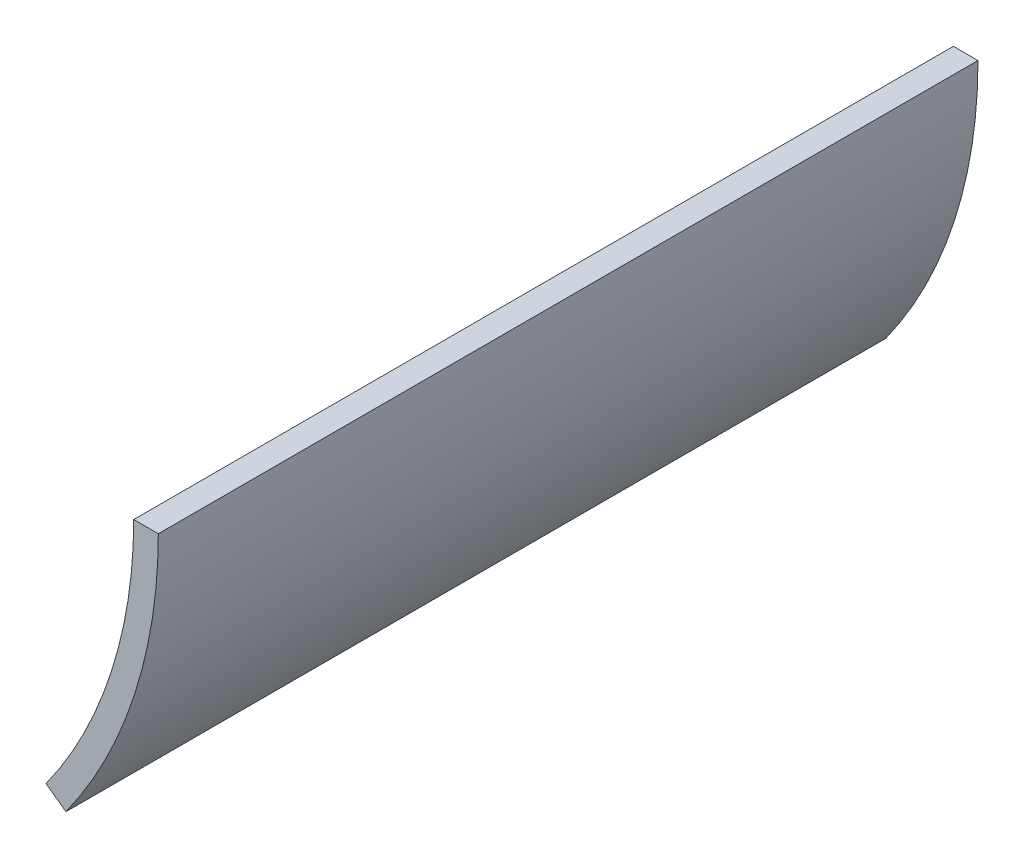
ISO-10303-21;
HEADER;
FILE_DESCRIPTION(('STEP AP214'),'2;1');
FILE_NAME('part.step','',(''),(''),'','','');
FILE_SCHEMA(('AUTOMOTIVE_DESIGN { 1 0 10303 214 1 1 1 1 }'));
ENDSEC;
DATA;
#1=APPLICATION_CONTEXT('core data for automotive mechanical design processes');
#2=APPLICATION_PROTOCOL_DEFINITION('international standard','automotive_design',2000,#1);
#3=PRODUCT_CONTEXT('',#1,'mechanical');
#4=PRODUCT('Part','Part','',(#3));
#5=PRODUCT_RELATED_PRODUCT_CATEGORY('part','',(#4));
#6=PRODUCT_DEFINITION_FORMATION('','',#4);
#7=PRODUCT_DEFINITION_CONTEXT('part definition',#1,'design');
#8=PRODUCT_DEFINITION('design','',#6,#7);
#9=PRODUCT_DEFINITION_SHAPE('','',#8);
#10=(LENGTH_UNIT() NAMED_UNIT(*) SI_UNIT(.MILLI.,.METRE.));
#11=(NAMED_UNIT(*) PLANE_ANGLE_UNIT() SI_UNIT($,.RADIAN.));
#12=(NAMED_UNIT(*) SI_UNIT($,.STERADIAN.) SOLID_ANGLE_UNIT());
#13=UNCERTAINTY_MEASURE_WITH_UNIT(LENGTH_MEASURE(1.E-05),#10,'distance_accuracy_value','');
#14=(GEOMETRIC_REPRESENTATION_CONTEXT(3) GLOBAL_UNCERTAINTY_ASSIGNED_CONTEXT((#13)) GLOBAL_UNIT_ASSIGNED_CONTEXT((#10,
#11,#12)) REPRESENTATION_CONTEXT('',''));
#15=CARTESIAN_POINT('',(0.,0.,0.));
#16=DIRECTION('',(0.,0.,1.));
#17=DIRECTION('',(1.,0.,0.));
#18=AXIS2_PLACEMENT_3D('',#15,#16,#17);
#19=CARTESIAN_POINT('',(-285.,0.,500.));
#20=DIRECTION('',(0.,0.,-1.));
#21=DIRECTION('',(-1.,0.,0.));
#22=AXIS2_PLACEMENT_3D('',#19,#20,#21);
#23=CYLINDRICAL_SURFACE('',#22,285.);
#24=CARTESIAN_POINT('',(-285.,0.,0.));
#25=DIRECTION('',(0.,0.,-1.));
#26=DIRECTION('',(1.,0.,0.));
#27=AXIS2_PLACEMENT_3D('',#24,#25,#26);
#28=CIRCLE('',#27,285.);
#29=CARTESIAN_POINT('',(0.,0.,0.));
#30=VERTEX_POINT('',#29);
#31=CARTESIAN_POINT('',(-53.5136343107871,-166.25,0.));
#32=VERTEX_POINT('',#31);
#33=EDGE_CURVE('E107',#30,#32,#28,.T.);
#34=ORIENTED_EDGE('',*,*,#33,.T.);
#35=DIRECTION('',(0.,0.,-1.));
#36=VECTOR('',#35,1.);
#37=CARTESIAN_POINT('',(-53.5136343107871,-166.25,500.));
#38=LINE('',#37,#36);
#39=CARTESIAN_POINT('',(-53.5136343107871,-166.25,500.));
#40=VERTEX_POINT('',#39);
#41=EDGE_CURVE('E11',#40,#32,#38,.T.);
#42=ORIENTED_EDGE('',*,*,#41,.F.);
#43=CARTESIAN_POINT('',(-285.,0.,500.));
#44=DIRECTION('',(0.,0.,-1.));
#45=DIRECTION('',(1.,0.,0.));
#46=AXIS2_PLACEMENT_3D('',#43,#44,#45);
#47=CIRCLE('',#46,285.);
#48=CARTESIAN_POINT('',(0.,0.,500.));
#49=VERTEX_POINT('',#48);
#50=EDGE_CURVE('E91',#49,#40,#47,.T.);
#51=ORIENTED_EDGE('',*,*,#50,.F.);
#52=DIRECTION('',(0.,0.,-1.));
#53=VECTOR('',#52,1.);
#54=CARTESIAN_POINT('',(0.,0.,500.));
#55=LINE('',#54,#53);
#56=EDGE_CURVE('E103',#49,#30,#55,.T.);
#57=ORIENTED_EDGE('',*,*,#56,.T.);
#58=EDGE_LOOP('',(#34,#42,#51,#57));
#59=FACE_BOUND('',#58,.T.);
#60=ADVANCED_FACE('F39',(#59),#23,.F.);
#61=CARTESIAN_POINT('',(-41.3301413797759,-175.,500.));
#62=DIRECTION('',(0.583333333333334,0.812232862067413,0.));
#63=DIRECTION('',(-0.812232862067413,0.583333333333334,0.));
#64=AXIS2_PLACEMENT_3D('',#61,#62,#63);
#65=PLANE('',#64);
#66=DIRECTION('',(0.812232862067413,-0.583333333333334,0.));
#67=VECTOR('',#66,1.);
#68=CARTESIAN_POINT('',(-41.3301413797759,-175.,0.));
#69=LINE('',#68,#67);
#70=CARTESIAN_POINT('',(-41.3301413797758,-175.,0.));
#71=VERTEX_POINT('',#70);
#72=EDGE_CURVE('E96',#32,#71,#69,.T.);
#73=ORIENTED_EDGE('',*,*,#72,.T.);
#74=DIRECTION('',(0.,0.,-1.));
#75=VECTOR('',#74,1.);
#76=CARTESIAN_POINT('',(-41.3301413797758,-175.,500.));
#77=LINE('',#76,#75);
#78=CARTESIAN_POINT('',(-41.3301413797758,-175.,500.));
#79=VERTEX_POINT('',#78);
#80=EDGE_CURVE('E48',#79,#71,#77,.T.);
#81=ORIENTED_EDGE('',*,*,#80,.F.);
#82=DIRECTION('',(0.812232862067413,-0.583333333333334,0.));
#83=VECTOR('',#82,1.);
#84=CARTESIAN_POINT('',(-41.3301413797759,-175.,500.));
#85=LINE('',#84,#83);
#86=EDGE_CURVE('E86',#40,#79,#85,.T.);
#87=ORIENTED_EDGE('',*,*,#86,.F.);
#88=ORIENTED_EDGE('',*,*,#41,.T.);
#89=EDGE_LOOP('',(#73,#81,#87,#88));
#90=FACE_BOUND('',#89,.T.);
#91=ADVANCED_FACE('F95',(#90),#65,.F.);
#92=CARTESIAN_POINT('',(-285.,0.,500.));
#93=DIRECTION('',(0.,0.,-1.));
#94=DIRECTION('',(-1.,0.,0.));
#95=AXIS2_PLACEMENT_3D('',#92,#93,#94);
#96=CYLINDRICAL_SURFACE('',#95,300.);
#97=CARTESIAN_POINT('',(-285.,0.,0.));
#98=DIRECTION('',(0.,0.,1.));
#99=DIRECTION('',(-1.,0.,0.));
#100=AXIS2_PLACEMENT_3D('',#97,#98,#99);
#101=CIRCLE('',#100,300.);
#102=CARTESIAN_POINT('',(15.,0.,0.));
#103=VERTEX_POINT('',#102);
#104=EDGE_CURVE('E73',#71,#103,#101,.T.);
#105=ORIENTED_EDGE('',*,*,#104,.T.);
#106=DIRECTION('',(0.,0.,-1.));
#107=VECTOR('',#106,1.);
#108=CARTESIAN_POINT('',(15.,0.,500.));
#109=LINE('',#108,#107);
#110=CARTESIAN_POINT('',(15.,0.,500.));
#111=VERTEX_POINT('',#110);
#112=EDGE_CURVE('E98',#111,#103,#109,.T.);
#113=ORIENTED_EDGE('',*,*,#112,.F.);
#114=CARTESIAN_POINT('',(-285.,0.,500.));
#115=DIRECTION('',(0.,0.,1.));
#116=DIRECTION('',(-1.,0.,0.));
#117=AXIS2_PLACEMENT_3D('',#114,#115,#116);
#118=CIRCLE('',#117,300.);
#119=EDGE_CURVE('E89',#79,#111,#118,.T.);
#120=ORIENTED_EDGE('',*,*,#119,.F.);
#121=ORIENTED_EDGE('',*,*,#80,.T.);
#122=EDGE_LOOP('',(#105,#113,#120,#121));
#123=FACE_BOUND('',#122,.T.);
#124=ADVANCED_FACE('F99',(#123),#96,.T.);
#125=CARTESIAN_POINT('',(0.,0.,500.));
#126=DIRECTION('',(0.,-1.,0.));
#127=DIRECTION('',(0.,0.,-1.));
#128=AXIS2_PLACEMENT_3D('',#125,#126,#127);
#129=PLANE('',#128);
#130=DIRECTION('',(-1.,0.,0.));
#131=VECTOR('',#130,1.);
#132=CARTESIAN_POINT('',(0.,0.,0.));
#133=LINE('',#132,#131);
#134=EDGE_CURVE('E79',#103,#30,#133,.T.);
#135=ORIENTED_EDGE('',*,*,#134,.T.);
#136=ORIENTED_EDGE('',*,*,#56,.F.);
#137=DIRECTION('',(-1.,0.,0.));
#138=VECTOR('',#137,1.);
#139=CARTESIAN_POINT('',(0.,0.,500.));
#140=LINE('',#139,#138);
#141=EDGE_CURVE('E56',#111,#49,#140,.T.);
#142=ORIENTED_EDGE('',*,*,#141,.F.);
#143=ORIENTED_EDGE('',*,*,#112,.T.);
#144=EDGE_LOOP('',(#135,#136,#142,#143));
#145=FACE_BOUND('',#144,.T.);
#146=ADVANCED_FACE('F120',(#145),#129,.F.);
#147=CARTESIAN_POINT('',(-285.,0.,500.));
#148=DIRECTION('',(0.,0.,1.));
#149=DIRECTION('',(1.,0.,0.));
#150=AXIS2_PLACEMENT_3D('',#147,#148,#149);
#151=PLANE('',#150);
#152=ORIENTED_EDGE('',*,*,#50,.T.);
#153=ORIENTED_EDGE('',*,*,#86,.T.);
#154=ORIENTED_EDGE('',*,*,#119,.T.);
#155=ORIENTED_EDGE('',*,*,#141,.T.);
#156=EDGE_LOOP('',(#152,#153,#154,#155));
#157=FACE_BOUND('',#156,.T.);
#158=ADVANCED_FACE('F87',(#157),#151,.T.);
#159=CARTESIAN_POINT('',(-285.,0.,0.));
#160=DIRECTION('',(0.,0.,1.));
#161=DIRECTION('',(1.,0.,0.));
#162=AXIS2_PLACEMENT_3D('',#159,#160,#161);
#163=PLANE('',#162);
#164=ORIENTED_EDGE('',*,*,#33,.F.);
#165=ORIENTED_EDGE('',*,*,#134,.F.);
#166=ORIENTED_EDGE('',*,*,#104,.F.);
#167=ORIENTED_EDGE('',*,*,#72,.F.);
#168=EDGE_LOOP('',(#164,#165,#166,#167));
#169=FACE_BOUND('',#168,.T.);
#170=ADVANCED_FACE('F123',(#169),#163,.F.);
#171=CLOSED_SHELL('',(#60,#91,#124,#146,#158,#170));
#172=MANIFOLD_SOLID_BREP('B2',#171);
#173=ADVANCED_BREP_SHAPE_REPRESENTATION('',(#18,#172),#14);
#174=SHAPE_DEFINITION_REPRESENTATION(#9,#173);
ENDSEC;
END-ISO-10303-21;
